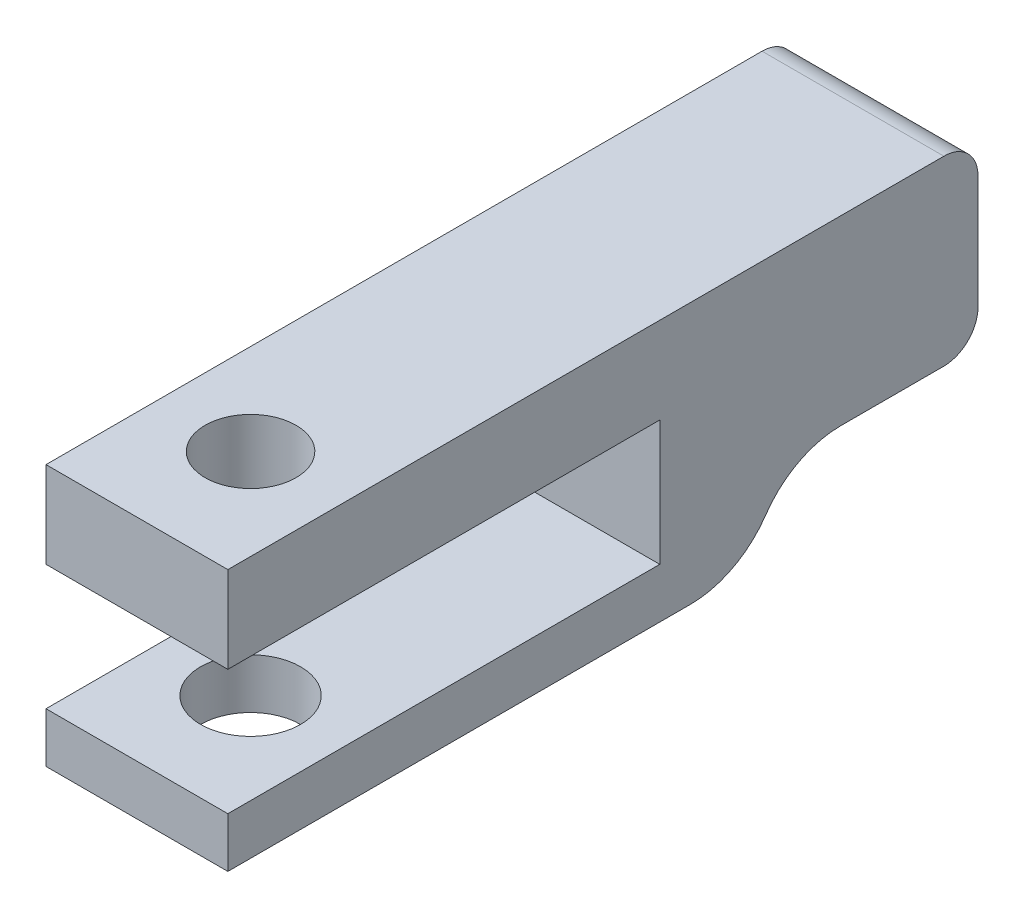
ISO-10303-21;
HEADER;
FILE_DESCRIPTION(('STEP AP214'),'2;1');
FILE_NAME('part.step','',(''),(''),'','','');
FILE_SCHEMA(('AUTOMOTIVE_DESIGN { 1 0 10303 214 1 1 1 1 }'));
ENDSEC;
DATA;
#1=APPLICATION_CONTEXT('core data for automotive mechanical design processes');
#2=APPLICATION_PROTOCOL_DEFINITION('international standard','automotive_design',2000,#1);
#3=PRODUCT_CONTEXT('',#1,'mechanical');
#4=PRODUCT('Part','Part','',(#3));
#5=PRODUCT_RELATED_PRODUCT_CATEGORY('part','',(#4));
#6=PRODUCT_DEFINITION_FORMATION('','',#4);
#7=PRODUCT_DEFINITION_CONTEXT('part definition',#1,'design');
#8=PRODUCT_DEFINITION('design','',#6,#7);
#9=PRODUCT_DEFINITION_SHAPE('','',#8);
#10=(LENGTH_UNIT() NAMED_UNIT(*) SI_UNIT(.MILLI.,.METRE.));
#11=(NAMED_UNIT(*) PLANE_ANGLE_UNIT() SI_UNIT($,.RADIAN.));
#12=(NAMED_UNIT(*) SI_UNIT($,.STERADIAN.) SOLID_ANGLE_UNIT());
#13=UNCERTAINTY_MEASURE_WITH_UNIT(LENGTH_MEASURE(1.E-05),#10,'distance_accuracy_value','');
#14=(GEOMETRIC_REPRESENTATION_CONTEXT(3) GLOBAL_UNCERTAINTY_ASSIGNED_CONTEXT((#13)) GLOBAL_UNIT_ASSIGNED_CONTEXT((#10,
#11,#12)) REPRESENTATION_CONTEXT('',''));
#15=CARTESIAN_POINT('',(0.,0.,0.));
#16=DIRECTION('',(0.,0.,1.));
#17=DIRECTION('',(1.,0.,0.));
#18=AXIS2_PLACEMENT_3D('',#15,#16,#17);
#19=CARTESIAN_POINT('',(-2.,-4.50000002980232,0.));
#20=DIRECTION('',(0.,1.,0.));
#21=DIRECTION('',(1.,0.,0.));
#22=AXIS2_PLACEMENT_3D('',#19,#20,#21);
#23=PLANE('',#22);
#24=CARTESIAN_POINT('',(0.,-4.50000002980232,0.));
#25=DIRECTION('',(0.,-1.,0.));
#26=DIRECTION('',(0.,0.,-1.));
#27=AXIS2_PLACEMENT_3D('',#24,#25,#26);
#28=CIRCLE('',#27,1.1);
#29=CARTESIAN_POINT('',(0.,-4.50000002980232,-1.1));
#30=VERTEX_POINT('',#29);
#31=EDGE_CURVE('E11',#30,#30,#28,.T.);
#32=ORIENTED_EDGE('',*,*,#31,.T.);
#33=EDGE_LOOP('',(#32));
#34=FACE_BOUND('',#33,.T.);
#35=DIRECTION('',(-1.,0.,0.));
#36=VECTOR('',#35,1.);
#37=CARTESIAN_POINT('',(-2.,-4.50000002980232,-7.));
#38=LINE('',#37,#36);
#39=CARTESIAN_POINT('',(2.,-4.50000002980232,-7.));
#40=VERTEX_POINT('',#39);
#41=CARTESIAN_POINT('',(-2.,-4.50000002980232,-7.));
#42=VERTEX_POINT('',#41);
#43=EDGE_CURVE('E24',#40,#42,#38,.T.);
#44=ORIENTED_EDGE('',*,*,#43,.T.);
#45=DIRECTION('',(0.,0.,-1.));
#46=VECTOR('',#45,1.);
#47=CARTESIAN_POINT('',(-2.,-4.50000002980232,0.));
#48=LINE('',#47,#46);
#49=CARTESIAN_POINT('',(-2.,-4.50000002980232,2.5));
#50=VERTEX_POINT('',#49);
#51=EDGE_CURVE('E34',#50,#42,#48,.T.);
#52=ORIENTED_EDGE('',*,*,#51,.F.);
#53=DIRECTION('',(-1.,0.,0.));
#54=VECTOR('',#53,1.);
#55=CARTESIAN_POINT('',(0.,-4.50000002980232,2.5));
#56=LINE('',#55,#54);
#57=CARTESIAN_POINT('',(2.,-4.50000002980232,2.5));
#58=VERTEX_POINT('',#57);
#59=EDGE_CURVE('E286',#58,#50,#56,.T.);
#60=ORIENTED_EDGE('',*,*,#59,.F.);
#61=DIRECTION('',(0.,0.,-1.));
#62=VECTOR('',#61,1.);
#63=CARTESIAN_POINT('',(2.,-4.50000002980232,0.));
#64=LINE('',#63,#62);
#65=EDGE_CURVE('E284',#58,#40,#64,.T.);
#66=ORIENTED_EDGE('',*,*,#65,.T.);
#67=EDGE_LOOP('',(#44,#52,#60,#66));
#68=FACE_BOUND('',#67,.T.);
#69=ADVANCED_FACE('F17',(#34,#68),#23,.T.);
#70=CARTESIAN_POINT('',(0.,-0.799999985098839,2.5));
#71=DIRECTION('',(0.,0.,1.));
#72=DIRECTION('',(0.,-1.,0.));
#73=AXIS2_PLACEMENT_3D('',#70,#71,#72);
#74=PLANE('',#73);
#75=DIRECTION('',(1.,0.,0.));
#76=VECTOR('',#75,1.);
#77=CARTESIAN_POINT('',(0.,-5.59999994039536,2.5));
#78=LINE('',#77,#76);
#79=CARTESIAN_POINT('',(-2.,-5.59999994039536,2.5));
#80=VERTEX_POINT('',#79);
#81=CARTESIAN_POINT('',(2.,-5.59999994039536,2.5));
#82=VERTEX_POINT('',#81);
#83=EDGE_CURVE('E282',#80,#82,#78,.T.);
#84=ORIENTED_EDGE('',*,*,#83,.T.);
#85=DIRECTION('',(0.,1.,0.));
#86=VECTOR('',#85,1.);
#87=CARTESIAN_POINT('',(2.,-0.799999985098838,2.5));
#88=LINE('',#87,#86);
#89=EDGE_CURVE('E279',#82,#58,#88,.T.);
#90=ORIENTED_EDGE('',*,*,#89,.T.);
#91=ORIENTED_EDGE('',*,*,#59,.T.);
#92=DIRECTION('',(0.,-1.,0.));
#93=VECTOR('',#92,1.);
#94=CARTESIAN_POINT('',(-2.,-0.79999998509884,2.5));
#95=LINE('',#94,#93);
#96=EDGE_CURVE('E277',#50,#80,#95,.T.);
#97=ORIENTED_EDGE('',*,*,#96,.T.);
#98=EDGE_LOOP('',(#84,#90,#91,#97));
#99=FACE_BOUND('',#98,.T.);
#100=ADVANCED_FACE('F324',(#99),#74,.T.);
#101=CARTESIAN_POINT('',(0.,-5.59999994039536,0.));
#102=DIRECTION('',(0.,1.,0.));
#103=DIRECTION('',(0.,0.,-1.));
#104=AXIS2_PLACEMENT_3D('',#101,#102,#103);
#105=CYLINDRICAL_SURFACE('',#104,1.1);
#106=ORIENTED_EDGE('',*,*,#31,.F.);
#107=EDGE_LOOP('',(#106));
#108=FACE_BOUND('',#107,.T.);
#109=CARTESIAN_POINT('',(0.,-5.59999994039536,0.));
#110=DIRECTION('',(0.,1.,0.));
#111=DIRECTION('',(0.,0.,-1.));
#112=AXIS2_PLACEMENT_3D('',#109,#110,#111);
#113=CIRCLE('',#112,1.1);
#114=CARTESIAN_POINT('',(0.,-5.59999994039536,-1.1));
#115=VERTEX_POINT('',#114);
#116=EDGE_CURVE('E272',#115,#115,#113,.T.);
#117=ORIENTED_EDGE('',*,*,#116,.F.);
#118=EDGE_LOOP('',(#117));
#119=FACE_BOUND('',#118,.T.);
#120=ADVANCED_FACE('F356',(#108,#119),#105,.F.);
#121=CARTESIAN_POINT('',(2.,-5.59999994039536,0.));
#122=DIRECTION('',(0.,-1.,0.));
#123=DIRECTION('',(-1.,0.,0.));
#124=AXIS2_PLACEMENT_3D('',#121,#122,#123);
#125=PLANE('',#124);
#126=ORIENTED_EDGE('',*,*,#116,.T.);
#127=EDGE_LOOP('',(#126));
#128=FACE_BOUND('',#127,.T.);
#129=DIRECTION('',(-1.,0.,0.));
#130=VECTOR('',#129,1.);
#131=CARTESIAN_POINT('',(2.,-5.59999994039536,-7.67712434446771));
#132=LINE('',#131,#130);
#133=CARTESIAN_POINT('',(2.,-5.59999994039536,-7.67712434446771));
#134=VERTEX_POINT('',#133);
#135=CARTESIAN_POINT('',(-2.,-5.59999994039536,-7.67712434446771));
#136=VERTEX_POINT('',#135);
#137=EDGE_CURVE('E267',#134,#136,#132,.T.);
#138=ORIENTED_EDGE('',*,*,#137,.F.);
#139=DIRECTION('',(0.,0.,1.));
#140=VECTOR('',#139,1.);
#141=CARTESIAN_POINT('',(2.,-5.59999994039536,0.));
#142=LINE('',#141,#140);
#143=EDGE_CURVE('E262',#134,#82,#142,.T.);
#144=ORIENTED_EDGE('',*,*,#143,.T.);
#145=ORIENTED_EDGE('',*,*,#83,.F.);
#146=DIRECTION('',(0.,0.,-1.));
#147=VECTOR('',#146,1.);
#148=CARTESIAN_POINT('',(-2.,-5.59999994039536,0.));
#149=LINE('',#148,#147);
#150=EDGE_CURVE('E258',#80,#136,#149,.T.);
#151=ORIENTED_EDGE('',*,*,#150,.T.);
#152=EDGE_LOOP('',(#138,#144,#145,#151));
#153=FACE_BOUND('',#152,.T.);
#154=ADVANCED_FACE('F327',(#128,#153),#125,.T.);
#155=CARTESIAN_POINT('',(-2.,-5.59999994039536,0.));
#156=DIRECTION('',(-1.,0.,0.));
#157=DIRECTION('',(0.,1.,0.));
#158=AXIS2_PLACEMENT_3D('',#155,#156,#157);
#159=PLANE('',#158);
#160=CARTESIAN_POINT('',(-2.,-0.599999940395356,-13.25));
#161=DIRECTION('',(1.,0.,0.));
#162=DIRECTION('',(0.,0.707106781186549,-0.707106781186546));
#163=AXIS2_PLACEMENT_3D('',#160,#161,#162);
#164=CIRCLE('',#163,0.75);
#165=CARTESIAN_POINT('',(-2.00000002980232,-0.599999940395356,-14.));
#166=VERTEX_POINT('',#165);
#167=CARTESIAN_POINT('',(-2.,0.150000059604644,-13.25));
#168=VERTEX_POINT('',#167);
#169=EDGE_CURVE('E254',#166,#168,#164,.T.);
#170=ORIENTED_EDGE('',*,*,#169,.F.);
#171=DIRECTION('',(0.,1.,0.));
#172=VECTOR('',#171,1.);
#173=CARTESIAN_POINT('',(-2.00000002980232,-3.84999994039535,-14.));
#174=LINE('',#173,#172);
#175=CARTESIAN_POINT('',(-2.00000002980232,-3.09999994039535,-14.));
#176=VERTEX_POINT('',#175);
#177=EDGE_CURVE('E126',#176,#166,#174,.T.);
#178=ORIENTED_EDGE('',*,*,#177,.F.);
#179=CARTESIAN_POINT('',(-2.,-3.09999994039535,-13.25));
#180=DIRECTION('',(1.,0.,0.));
#181=DIRECTION('',(0.,-0.707106781186548,-0.707106781186547));
#182=AXIS2_PLACEMENT_3D('',#179,#180,#181);
#183=CIRCLE('',#182,0.75);
#184=CARTESIAN_POINT('',(-2.00000002980232,-3.84999994039535,-13.25));
#185=VERTEX_POINT('',#184);
#186=EDGE_CURVE('E246',#185,#176,#183,.T.);
#187=ORIENTED_EDGE('',*,*,#186,.F.);
#188=DIRECTION('',(0.,0.,-1.));
#189=VECTOR('',#188,1.);
#190=CARTESIAN_POINT('',(-2.00000002980232,-3.84999994039535,-9.));
#191=LINE('',#190,#189);
#192=CARTESIAN_POINT('',(-2.00000002980232,-3.84999994039535,-10.9843134832984));
#193=VERTEX_POINT('',#192);
#194=EDGE_CURVE('E241',#193,#185,#191,.T.);
#195=ORIENTED_EDGE('',*,*,#194,.F.);
#196=CARTESIAN_POINT('',(-2.,-5.84999994039535,-10.9843134832984));
#197=DIRECTION('',(-1.,0.,0.));
#198=DIRECTION('',(0.,0.125,0.992156741649222));
#199=AXIS2_PLACEMENT_3D('',#196,#197,#198);
#200=CIRCLE('',#199,2.);
#201=CARTESIAN_POINT('',(-2.,-4.72499994039536,-9.33071891388307));
#202=VERTEX_POINT('',#201);
#203=EDGE_CURVE('E236',#202,#193,#200,.T.);
#204=ORIENTED_EDGE('',*,*,#203,.F.);
#205=CARTESIAN_POINT('',(-2.,-3.59999994039536,-7.67712434446771));
#206=DIRECTION('',(1.,0.,0.));
#207=DIRECTION('',(0.,-0.883883476483184,-0.467707173346743));
#208=AXIS2_PLACEMENT_3D('',#205,#206,#207);
#209=CIRCLE('',#208,2.);
#210=EDGE_CURVE('E231',#136,#202,#209,.T.);
#211=ORIENTED_EDGE('',*,*,#210,.F.);
#212=ORIENTED_EDGE('',*,*,#150,.F.);
#213=ORIENTED_EDGE('',*,*,#96,.F.);
#214=ORIENTED_EDGE('',*,*,#51,.T.);
#215=DIRECTION('',(0.,1.,0.));
#216=VECTOR('',#215,1.);
#217=CARTESIAN_POINT('',(-2.,-5.59999994039536,-7.));
#218=LINE('',#217,#216);
#219=CARTESIAN_POINT('',(-2.,-1.75000002980232,-7.));
#220=VERTEX_POINT('',#219);
#221=EDGE_CURVE('E227',#42,#220,#218,.T.);
#222=ORIENTED_EDGE('',*,*,#221,.T.);
#223=DIRECTION('',(0.,0.,-1.));
#224=VECTOR('',#223,1.);
#225=CARTESIAN_POINT('',(-2.,-1.75000002980232,0.));
#226=LINE('',#225,#224);
#227=CARTESIAN_POINT('',(-2.,-1.75000002980232,2.5));
#228=VERTEX_POINT('',#227);
#229=EDGE_CURVE('E222',#228,#220,#226,.T.);
#230=ORIENTED_EDGE('',*,*,#229,.F.);
#231=DIRECTION('',(0.,-1.,0.));
#232=VECTOR('',#231,1.);
#233=CARTESIAN_POINT('',(-2.,-1.75000002980232,2.5));
#234=LINE('',#233,#232);
#235=CARTESIAN_POINT('',(-2.,0.150000059604644,2.5));
#236=VERTEX_POINT('',#235);
#237=EDGE_CURVE('E217',#236,#228,#234,.T.);
#238=ORIENTED_EDGE('',*,*,#237,.F.);
#239=DIRECTION('',(0.,0.,-1.));
#240=VECTOR('',#239,1.);
#241=CARTESIAN_POINT('',(-2.,0.150000059604644,0.));
#242=LINE('',#241,#240);
#243=EDGE_CURVE('E213',#236,#168,#242,.T.);
#244=ORIENTED_EDGE('',*,*,#243,.T.);
#245=EDGE_LOOP('',(#170,#178,#187,#195,#204,#211,#212,#213,#214,#222,#230,#238,#244));
#246=FACE_BOUND('',#245,.T.);
#247=ADVANCED_FACE('F297',(#246),#159,.T.);
#248=CARTESIAN_POINT('',(-2.,-5.59999994039536,-7.));
#249=DIRECTION('',(0.,0.,1.));
#250=DIRECTION('',(1.,0.,0.));
#251=AXIS2_PLACEMENT_3D('',#248,#249,#250);
#252=PLANE('',#251);
#253=DIRECTION('',(-1.,0.,0.));
#254=VECTOR('',#253,1.);
#255=CARTESIAN_POINT('',(0.,-1.75000002980232,-7.));
#256=LINE('',#255,#254);
#257=CARTESIAN_POINT('',(2.,-1.75000002980232,-7.));
#258=VERTEX_POINT('',#257);
#259=EDGE_CURVE('E208',#258,#220,#256,.T.);
#260=ORIENTED_EDGE('',*,*,#259,.T.);
#261=ORIENTED_EDGE('',*,*,#221,.F.);
#262=ORIENTED_EDGE('',*,*,#43,.F.);
#263=DIRECTION('',(0.,1.,0.));
#264=VECTOR('',#263,1.);
#265=CARTESIAN_POINT('',(2.,-5.59999994039536,-7.));
#266=LINE('',#265,#264);
#267=EDGE_CURVE('E206',#40,#258,#266,.T.);
#268=ORIENTED_EDGE('',*,*,#267,.T.);
#269=EDGE_LOOP('',(#260,#261,#262,#268));
#270=FACE_BOUND('',#269,.T.);
#271=ADVANCED_FACE('F300',(#270),#252,.T.);
#272=CARTESIAN_POINT('',(2.,-1.75000002980232,0.));
#273=DIRECTION('',(0.,-1.,0.));
#274=DIRECTION('',(-1.,0.,0.));
#275=AXIS2_PLACEMENT_3D('',#272,#273,#274);
#276=PLANE('',#275);
#277=CARTESIAN_POINT('',(0.,-1.75000002980232,0.));
#278=DIRECTION('',(0.,1.,0.));
#279=DIRECTION('',(0.,0.,-1.));
#280=AXIS2_PLACEMENT_3D('',#277,#278,#279);
#281=CIRCLE('',#280,1.);
#282=CARTESIAN_POINT('',(0.,-1.75000002980232,-1.));
#283=VERTEX_POINT('',#282);
#284=EDGE_CURVE('E201',#283,#283,#281,.T.);
#285=ORIENTED_EDGE('',*,*,#284,.T.);
#286=EDGE_LOOP('',(#285));
#287=FACE_BOUND('',#286,.T.);
#288=ORIENTED_EDGE('',*,*,#259,.F.);
#289=DIRECTION('',(0.,0.,-1.));
#290=VECTOR('',#289,1.);
#291=CARTESIAN_POINT('',(2.,-1.75000002980232,0.));
#292=LINE('',#291,#290);
#293=CARTESIAN_POINT('',(2.,-1.75000002980232,2.5));
#294=VERTEX_POINT('',#293);
#295=EDGE_CURVE('E196',#294,#258,#292,.T.);
#296=ORIENTED_EDGE('',*,*,#295,.F.);
#297=DIRECTION('',(1.,0.,0.));
#298=VECTOR('',#297,1.);
#299=CARTESIAN_POINT('',(2.,-1.75000002980232,2.5));
#300=LINE('',#299,#298);
#301=EDGE_CURVE('E191',#228,#294,#300,.T.);
#302=ORIENTED_EDGE('',*,*,#301,.F.);
#303=ORIENTED_EDGE('',*,*,#229,.T.);
#304=EDGE_LOOP('',(#288,#296,#302,#303));
#305=FACE_BOUND('',#304,.T.);
#306=ADVANCED_FACE('F305',(#287,#305),#276,.T.);
#307=DIRECTION('',(0.,1.,0.));
#308=VECTOR('',#307,1.);
#309=CARTESIAN_POINT('',(2.,0.150000059604646,2.5));
#310=LINE('',#309,#308);
#311=CARTESIAN_POINT('',(2.,0.150000059604646,2.5));
#312=VERTEX_POINT('',#311);
#313=EDGE_CURVE('E187',#294,#312,#310,.T.);
#314=ORIENTED_EDGE('',*,*,#313,.T.);
#315=DIRECTION('',(-1.,0.,0.));
#316=VECTOR('',#315,1.);
#317=CARTESIAN_POINT('',(2.,0.150000059604646,2.5));
#318=LINE('',#317,#316);
#319=EDGE_CURVE('E184',#312,#236,#318,.T.);
#320=ORIENTED_EDGE('',*,*,#319,.T.);
#321=ORIENTED_EDGE('',*,*,#237,.T.);
#322=ORIENTED_EDGE('',*,*,#301,.T.);
#323=EDGE_LOOP('',(#314,#320,#321,#322));
#324=FACE_BOUND('',#323,.T.);
#325=ADVANCED_FACE('F309',(#324),#74,.T.);
#326=CARTESIAN_POINT('',(0.,-1.75000002980232,0.));
#327=DIRECTION('',(0.,1.,0.));
#328=DIRECTION('',(0.,0.,-1.));
#329=AXIS2_PLACEMENT_3D('',#326,#327,#328);
#330=CYLINDRICAL_SURFACE('',#329,1.);
#331=CARTESIAN_POINT('',(0.,0.150000059604645,0.));
#332=DIRECTION('',(0.,1.,0.));
#333=DIRECTION('',(0.,0.,-1.));
#334=AXIS2_PLACEMENT_3D('',#331,#332,#333);
#335=CIRCLE('',#334,1.);
#336=CARTESIAN_POINT('',(0.,0.150000059604645,-1.));
#337=VERTEX_POINT('',#336);
#338=EDGE_CURVE('E181',#337,#337,#335,.T.);
#339=ORIENTED_EDGE('',*,*,#338,.T.);
#340=EDGE_LOOP('',(#339));
#341=FACE_BOUND('',#340,.T.);
#342=ORIENTED_EDGE('',*,*,#284,.F.);
#343=EDGE_LOOP('',(#342));
#344=FACE_BOUND('',#343,.T.);
#345=ADVANCED_FACE('F373',(#341,#344),#330,.F.);
#346=CARTESIAN_POINT('',(0.,-5.04999998509884,-9.));
#347=DIRECTION('',(0.,0.,-1.));
#348=DIRECTION('',(0.,1.,0.));
#349=AXIS2_PLACEMENT_3D('',#346,#347,#348);
#350=PLANE('',#349);
#351=CARTESIAN_POINT('',(0.,-1.84999994039536,-9.));
#352=DIRECTION('',(0.,0.,-1.));
#353=DIRECTION('',(0.,1.,0.));
#354=AXIS2_PLACEMENT_3D('',#351,#352,#353);
#355=CIRCLE('',#354,1.05568675851512);
#356=CARTESIAN_POINT('',(0.,-0.79431318188024,-9.));
#357=VERTEX_POINT('',#356);
#358=EDGE_CURVE('E178',#357,#357,#355,.T.);
#359=ORIENTED_EDGE('',*,*,#358,.T.);
#360=EDGE_LOOP('',(#359));
#361=FACE_BOUND('',#360,.T.);
#362=ADVANCED_FACE('F379',(#361),#350,.T.);
#363=CARTESIAN_POINT('',(0.,-1.84999994039536,-9.));
#364=DIRECTION('',(0.,0.,-1.));
#365=DIRECTION('',(0.,1.,0.));
#366=AXIS2_PLACEMENT_3D('',#363,#364,#365);
#367=CYLINDRICAL_SURFACE('',#366,1.05568675851512);
#368=ORIENTED_EDGE('',*,*,#358,.F.);
#369=EDGE_LOOP('',(#368));
#370=FACE_BOUND('',#369,.T.);
#371=CARTESIAN_POINT('',(0.,-1.84999994039536,-14.));
#372=DIRECTION('',(0.,0.,1.));
#373=DIRECTION('',(0.,1.,0.));
#374=AXIS2_PLACEMENT_3D('',#371,#372,#373);
#375=CIRCLE('',#374,1.05568675851512);
#376=CARTESIAN_POINT('',(0.,-0.79431318188024,-14.));
#377=VERTEX_POINT('',#376);
#378=EDGE_CURVE('E173',#377,#377,#375,.T.);
#379=ORIENTED_EDGE('',*,*,#378,.F.);
#380=EDGE_LOOP('',(#379));
#381=FACE_BOUND('',#380,.T.);
#382=ADVANCED_FACE('F390',(#370,#381),#367,.F.);
#383=CARTESIAN_POINT('',(2.,-5.84999994039535,-10.9843134832984));
#384=DIRECTION('',(-1.,0.,0.));
#385=DIRECTION('',(0.,0.125,0.992156741649222));
#386=AXIS2_PLACEMENT_3D('',#383,#384,#385);
#387=CYLINDRICAL_SURFACE('',#386,2.);
#388=DIRECTION('',(1.,0.,0.));
#389=VECTOR('',#388,1.);
#390=CARTESIAN_POINT('',(2.,-4.72499994039536,-9.33071891388307));
#391=LINE('',#390,#389);
#392=CARTESIAN_POINT('',(2.,-4.72499994039536,-9.33071891388307));
#393=VERTEX_POINT('',#392);
#394=EDGE_CURVE('E168',#202,#393,#391,.T.);
#395=ORIENTED_EDGE('',*,*,#394,.F.);
#396=ORIENTED_EDGE('',*,*,#203,.T.);
#397=DIRECTION('',(1.,0.,0.));
#398=VECTOR('',#397,1.);
#399=CARTESIAN_POINT('',(2.,-3.84999994039535,-10.9843134832984));
#400=LINE('',#399,#398);
#401=CARTESIAN_POINT('',(2.00000002980232,-3.84999994039535,-10.9843134832984));
#402=VERTEX_POINT('',#401);
#403=EDGE_CURVE('E164',#193,#402,#400,.T.);
#404=ORIENTED_EDGE('',*,*,#403,.T.);
#405=CARTESIAN_POINT('',(2.,-5.84999994039535,-10.9843134832984));
#406=DIRECTION('',(1.,0.,0.));
#407=DIRECTION('',(0.,0.125,0.992156741649222));
#408=AXIS2_PLACEMENT_3D('',#405,#406,#407);
#409=CIRCLE('',#408,2.);
#410=EDGE_CURVE('E160',#402,#393,#409,.T.);
#411=ORIENTED_EDGE('',*,*,#410,.T.);
#412=EDGE_LOOP('',(#395,#396,#404,#411));
#413=FACE_BOUND('',#412,.T.);
#414=ADVANCED_FACE('F335',(#413),#387,.F.);
#415=CARTESIAN_POINT('',(2.,-3.59999994039536,-7.67712434446771));
#416=DIRECTION('',(-1.,0.,0.));
#417=DIRECTION('',(0.,-0.883883476483184,-0.467707173346743));
#418=AXIS2_PLACEMENT_3D('',#415,#416,#417);
#419=CYLINDRICAL_SURFACE('',#418,2.);
#420=ORIENTED_EDGE('',*,*,#210,.T.);
#421=ORIENTED_EDGE('',*,*,#394,.T.);
#422=CARTESIAN_POINT('',(2.,-3.59999994039536,-7.67712434446771));
#423=DIRECTION('',(-1.,0.,0.));
#424=DIRECTION('',(0.,-0.883883476483184,-0.467707173346743));
#425=AXIS2_PLACEMENT_3D('',#422,#423,#424);
#426=CIRCLE('',#425,2.);
#427=EDGE_CURVE('E155',#393,#134,#426,.T.);
#428=ORIENTED_EDGE('',*,*,#427,.T.);
#429=ORIENTED_EDGE('',*,*,#137,.T.);
#430=EDGE_LOOP('',(#420,#421,#428,#429));
#431=FACE_BOUND('',#430,.T.);
#432=ADVANCED_FACE('F331',(#431),#419,.T.);
#433=CARTESIAN_POINT('',(2.00000002980232,-3.84999994039535,-9.));
#434=DIRECTION('',(0.,-1.,0.));
#435=DIRECTION('',(-1.,0.,0.));
#436=AXIS2_PLACEMENT_3D('',#433,#434,#435);
#437=PLANE('',#436);
#438=DIRECTION('',(-1.,0.,0.));
#439=VECTOR('',#438,1.);
#440=CARTESIAN_POINT('',(1.00000001490116,-3.84999994039535,-13.25));
#441=LINE('',#440,#439);
#442=CARTESIAN_POINT('',(2.00000002980232,-3.84999994039535,-13.25));
#443=VERTEX_POINT('',#442);
#444=EDGE_CURVE('E150',#443,#185,#441,.T.);
#445=ORIENTED_EDGE('',*,*,#444,.F.);
#446=DIRECTION('',(0.,0.,-1.));
#447=VECTOR('',#446,1.);
#448=CARTESIAN_POINT('',(2.00000002980232,-3.84999994039535,-9.));
#449=LINE('',#448,#447);
#450=EDGE_CURVE('E146',#402,#443,#449,.T.);
#451=ORIENTED_EDGE('',*,*,#450,.F.);
#452=ORIENTED_EDGE('',*,*,#403,.F.);
#453=ORIENTED_EDGE('',*,*,#194,.T.);
#454=EDGE_LOOP('',(#445,#451,#452,#453));
#455=FACE_BOUND('',#454,.T.);
#456=ADVANCED_FACE('F339',(#455),#437,.T.);
#457=CARTESIAN_POINT('',(1.00000001490116,-3.09999994039535,-13.25));
#458=DIRECTION('',(-1.,0.,0.));
#459=DIRECTION('',(0.,-0.707106781186548,-0.707106781186547));
#460=AXIS2_PLACEMENT_3D('',#457,#458,#459);
#461=CYLINDRICAL_SURFACE('',#460,0.75);
#462=ORIENTED_EDGE('',*,*,#186,.T.);
#463=DIRECTION('',(1.,0.,0.));
#464=VECTOR('',#463,1.);
#465=CARTESIAN_POINT('',(1.00000001490116,-3.09999994039535,-14.));
#466=LINE('',#465,#464);
#467=CARTESIAN_POINT('',(2.00000002980232,-3.09999994039535,-14.));
#468=VERTEX_POINT('',#467);
#469=EDGE_CURVE('E135',#176,#468,#466,.T.);
#470=ORIENTED_EDGE('',*,*,#469,.T.);
#471=CARTESIAN_POINT('',(2.,-3.09999994039535,-13.25));
#472=DIRECTION('',(-1.,0.,0.));
#473=DIRECTION('',(0.,-0.707106781186548,-0.707106781186547));
#474=AXIS2_PLACEMENT_3D('',#471,#472,#473);
#475=CIRCLE('',#474,0.75);
#476=EDGE_CURVE('E117',#468,#443,#475,.T.);
#477=ORIENTED_EDGE('',*,*,#476,.T.);
#478=ORIENTED_EDGE('',*,*,#444,.T.);
#479=EDGE_LOOP('',(#462,#470,#477,#478));
#480=FACE_BOUND('',#479,.T.);
#481=ADVANCED_FACE('F341',(#480),#461,.T.);
#482=CARTESIAN_POINT('',(2.,-4.50000002980232,0.));
#483=DIRECTION('',(1.,0.,0.));
#484=DIRECTION('',(0.,-1.,0.));
#485=AXIS2_PLACEMENT_3D('',#482,#483,#484);
#486=PLANE('',#485);
#487=CARTESIAN_POINT('',(2.,-0.599999940395354,-13.25));
#488=DIRECTION('',(-1.,0.,0.));
#489=DIRECTION('',(0.,0.707106781186549,-0.707106781186546));
#490=AXIS2_PLACEMENT_3D('',#487,#488,#489);
#491=CIRCLE('',#490,0.75);
#492=CARTESIAN_POINT('',(2.,0.150000059604646,-13.25));
#493=VERTEX_POINT('',#492);
#494=CARTESIAN_POINT('',(2.00000002980232,-0.599999940395354,-14.));
#495=VERTEX_POINT('',#494);
#496=EDGE_CURVE('E113',#493,#495,#491,.T.);
#497=ORIENTED_EDGE('',*,*,#496,.F.);
#498=DIRECTION('',(0.,0.,1.));
#499=VECTOR('',#498,1.);
#500=CARTESIAN_POINT('',(2.,0.150000059604646,0.));
#501=LINE('',#500,#499);
#502=EDGE_CURVE('E120',#493,#312,#501,.T.);
#503=ORIENTED_EDGE('',*,*,#502,.T.);
#504=ORIENTED_EDGE('',*,*,#313,.F.);
#505=ORIENTED_EDGE('',*,*,#295,.T.);
#506=ORIENTED_EDGE('',*,*,#267,.F.);
#507=ORIENTED_EDGE('',*,*,#65,.F.);
#508=ORIENTED_EDGE('',*,*,#89,.F.);
#509=ORIENTED_EDGE('',*,*,#143,.F.);
#510=ORIENTED_EDGE('',*,*,#427,.F.);
#511=ORIENTED_EDGE('',*,*,#410,.F.);
#512=ORIENTED_EDGE('',*,*,#450,.T.);
#513=ORIENTED_EDGE('',*,*,#476,.F.);
#514=DIRECTION('',(0.,-1.,0.));
#515=VECTOR('',#514,1.);
#516=CARTESIAN_POINT('',(2.00000002980232,0.150000059604646,-14.));
#517=LINE('',#516,#515);
#518=EDGE_CURVE('E108',#495,#468,#517,.T.);
#519=ORIENTED_EDGE('',*,*,#518,.F.);
#520=EDGE_LOOP('',(#497,#503,#504,#505,#506,#507,#508,#509,#510,#511,#512,#513,#519));
#521=FACE_BOUND('',#520,.T.);
#522=ADVANCED_FACE('F110',(#521),#486,.T.);
#523=CARTESIAN_POINT('',(0.,-1.84999994039536,-14.));
#524=DIRECTION('',(0.,0.,-1.));
#525=DIRECTION('',(0.,1.,0.));
#526=AXIS2_PLACEMENT_3D('',#523,#524,#525);
#527=PLANE('',#526);
#528=ORIENTED_EDGE('',*,*,#378,.T.);
#529=EDGE_LOOP('',(#528));
#530=FACE_BOUND('',#529,.T.);
#531=DIRECTION('',(-1.,0.,0.));
#532=VECTOR('',#531,1.);
#533=CARTESIAN_POINT('',(-1.,-0.599999940395356,-14.));
#534=LINE('',#533,#532);
#535=EDGE_CURVE('E121',#495,#166,#534,.T.);
#536=ORIENTED_EDGE('',*,*,#535,.F.);
#537=ORIENTED_EDGE('',*,*,#518,.T.);
#538=ORIENTED_EDGE('',*,*,#469,.F.);
#539=ORIENTED_EDGE('',*,*,#177,.T.);
#540=EDGE_LOOP('',(#536,#537,#538,#539));
#541=FACE_BOUND('',#540,.T.);
#542=ADVANCED_FACE('F125',(#530,#541),#527,.T.);
#543=CARTESIAN_POINT('',(-1.,-0.599999940395356,-13.25));
#544=DIRECTION('',(1.,0.,0.));
#545=DIRECTION('',(0.,0.707106781186549,-0.707106781186546));
#546=AXIS2_PLACEMENT_3D('',#543,#544,#545);
#547=CYLINDRICAL_SURFACE('',#546,0.75);
#548=ORIENTED_EDGE('',*,*,#496,.T.);
#549=ORIENTED_EDGE('',*,*,#535,.T.);
#550=ORIENTED_EDGE('',*,*,#169,.T.);
#551=DIRECTION('',(1.,0.,0.));
#552=VECTOR('',#551,1.);
#553=CARTESIAN_POINT('',(-1.,0.150000059604644,-13.25));
#554=LINE('',#553,#552);
#555=EDGE_CURVE('E129',#168,#493,#554,.T.);
#556=ORIENTED_EDGE('',*,*,#555,.T.);
#557=EDGE_LOOP('',(#548,#549,#550,#556));
#558=FACE_BOUND('',#557,.T.);
#559=ADVANCED_FACE('F131',(#558),#547,.T.);
#560=CARTESIAN_POINT('',(-2.,0.150000059604644,0.));
#561=DIRECTION('',(0.,1.,0.));
#562=DIRECTION('',(1.,0.,0.));
#563=AXIS2_PLACEMENT_3D('',#560,#561,#562);
#564=PLANE('',#563);
#565=ORIENTED_EDGE('',*,*,#338,.F.);
#566=EDGE_LOOP('',(#565));
#567=FACE_BOUND('',#566,.T.);
#568=ORIENTED_EDGE('',*,*,#555,.F.);
#569=ORIENTED_EDGE('',*,*,#243,.F.);
#570=ORIENTED_EDGE('',*,*,#319,.F.);
#571=ORIENTED_EDGE('',*,*,#502,.F.);
#572=EDGE_LOOP('',(#568,#569,#570,#571));
#573=FACE_BOUND('',#572,.T.);
#574=ADVANCED_FACE('F312',(#567,#573),#564,.T.);
#575=CLOSED_SHELL('',(#69,#100,#120,#154,#247,#271,#306,#325,#345,#362,#382,#414,#432,#456,#481,
#522,#542,#559,#574));
#576=MANIFOLD_SOLID_BREP('B1',#575);
#577=ADVANCED_BREP_SHAPE_REPRESENTATION('',(#18,#576),#14);
#578=SHAPE_DEFINITION_REPRESENTATION(#9,#577);
ENDSEC;
END-ISO-10303-21;
